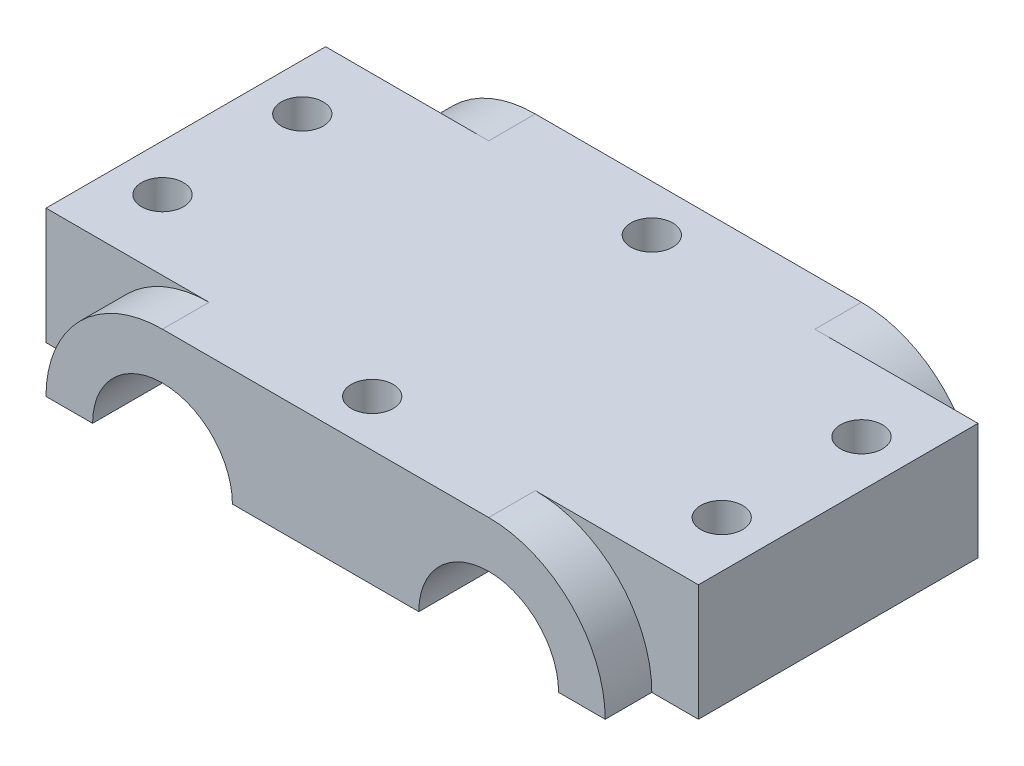
ISO-10303-21;
HEADER;
FILE_DESCRIPTION(('STEP AP214'),'2;1');
FILE_NAME('part.step','',(''),(''),'','','');
FILE_SCHEMA(('AUTOMOTIVE_DESIGN { 1 0 10303 214 1 1 1 1 }'));
ENDSEC;
DATA;
#1=APPLICATION_CONTEXT('core data for automotive mechanical design processes');
#2=APPLICATION_PROTOCOL_DEFINITION('international standard','automotive_design',2000,#1);
#3=PRODUCT_CONTEXT('',#1,'mechanical');
#4=PRODUCT('Part','Part','',(#3));
#5=PRODUCT_RELATED_PRODUCT_CATEGORY('part','',(#4));
#6=PRODUCT_DEFINITION_FORMATION('','',#4);
#7=PRODUCT_DEFINITION_CONTEXT('part definition',#1,'design');
#8=PRODUCT_DEFINITION('design','',#6,#7);
#9=PRODUCT_DEFINITION_SHAPE('','',#8);
#10=(LENGTH_UNIT() NAMED_UNIT(*) SI_UNIT(.MILLI.,.METRE.));
#11=(NAMED_UNIT(*) PLANE_ANGLE_UNIT() SI_UNIT($,.RADIAN.));
#12=(NAMED_UNIT(*) SI_UNIT($,.STERADIAN.) SOLID_ANGLE_UNIT());
#13=UNCERTAINTY_MEASURE_WITH_UNIT(LENGTH_MEASURE(1.E-05),#10,'distance_accuracy_value','');
#14=(GEOMETRIC_REPRESENTATION_CONTEXT(3) GLOBAL_UNCERTAINTY_ASSIGNED_CONTEXT((#13)) GLOBAL_UNIT_ASSIGNED_CONTEXT((#10,
#11,#12)) REPRESENTATION_CONTEXT('',''));
#15=CARTESIAN_POINT('',(0.,0.,0.));
#16=DIRECTION('',(0.,0.,1.));
#17=DIRECTION('',(1.,0.,0.));
#18=AXIS2_PLACEMENT_3D('',#15,#16,#17);
#19=CARTESIAN_POINT('',(70.,0.,30.));
#20=DIRECTION('',(0.,1.,0.));
#21=DIRECTION('',(-1.,0.,0.));
#22=AXIS2_PLACEMENT_3D('',#19,#20,#21);
#23=PLANE('',#22);
#24=CARTESIAN_POINT('',(35.,0.,30.));
#25=DIRECTION('',(0.,1.,0.));
#26=DIRECTION('',(-1.,0.,0.));
#27=AXIS2_PLACEMENT_3D('',#24,#25,#26);
#28=CIRCLE('',#27,2.25);
#29=CARTESIAN_POINT('',(32.75,0.,30.));
#30=VERTEX_POINT('',#29);
#31=EDGE_CURVE('E294',#30,#30,#28,.T.);
#32=ORIENTED_EDGE('',*,*,#31,.T.);
#33=EDGE_LOOP('',(#32));
#34=FACE_BOUND('',#33,.T.);
#35=CARTESIAN_POINT('',(35.,0.,0.));
#36=DIRECTION('',(0.,1.,0.));
#37=DIRECTION('',(-1.,0.,0.));
#38=AXIS2_PLACEMENT_3D('',#35,#36,#37);
#39=CIRCLE('',#38,2.25);
#40=CARTESIAN_POINT('',(32.75,0.,0.));
#41=VERTEX_POINT('',#40);
#42=EDGE_CURVE('E309',#41,#41,#39,.T.);
#43=ORIENTED_EDGE('',*,*,#42,.T.);
#44=EDGE_LOOP('',(#43));
#45=FACE_BOUND('',#44,.T.);
#46=DIRECTION('',(0.,0.,-1.));
#47=VECTOR('',#46,1.);
#48=CARTESIAN_POINT('',(25.,0.,35.));
#49=LINE('',#48,#47);
#50=CARTESIAN_POINT('',(25.,0.,35.));
#51=VERTEX_POINT('',#50);
#52=CARTESIAN_POINT('',(25.,0.,-5.));
#53=VERTEX_POINT('',#52);
#54=EDGE_CURVE('E284',#51,#53,#49,.T.);
#55=ORIENTED_EDGE('',*,*,#54,.T.);
#56=DIRECTION('',(1.,0.,0.));
#57=VECTOR('',#56,1.);
#58=CARTESIAN_POINT('',(35.,0.,-5.));
#59=LINE('',#58,#57);
#60=CARTESIAN_POINT('',(45.,0.,-5.));
#61=VERTEX_POINT('',#60);
#62=EDGE_CURVE('E170',#53,#61,#59,.T.);
#63=ORIENTED_EDGE('',*,*,#62,.T.);
#64=DIRECTION('',(0.,0.,-1.));
#65=VECTOR('',#64,1.);
#66=CARTESIAN_POINT('',(45.,0.,35.));
#67=LINE('',#66,#65);
#68=CARTESIAN_POINT('',(45.,0.,35.));
#69=VERTEX_POINT('',#68);
#70=EDGE_CURVE('E156',#69,#61,#67,.T.);
#71=ORIENTED_EDGE('',*,*,#70,.F.);
#72=DIRECTION('',(1.,0.,0.));
#73=VECTOR('',#72,1.);
#74=CARTESIAN_POINT('',(45.,0.,35.));
#75=LINE('',#74,#73);
#76=EDGE_CURVE('E162',#51,#69,#75,.T.);
#77=ORIENTED_EDGE('',*,*,#76,.F.);
#78=EDGE_LOOP('',(#55,#63,#71,#77));
#79=FACE_BOUND('',#78,.T.);
#80=ADVANCED_FACE('F39',(#34,#45,#79),#23,.F.);
#81=CARTESIAN_POINT('',(65.,0.,7.5));
#82=DIRECTION('',(0.,1.,0.));
#83=DIRECTION('',(-1.,0.,0.));
#84=AXIS2_PLACEMENT_3D('',#81,#82,#83);
#85=CIRCLE('',#84,2.25);
#86=CARTESIAN_POINT('',(62.75,0.,7.5));
#87=VERTEX_POINT('',#86);
#88=EDGE_CURVE('E292',#87,#87,#85,.T.);
#89=ORIENTED_EDGE('',*,*,#88,.T.);
#90=EDGE_LOOP('',(#89));
#91=FACE_BOUND('',#90,.T.);
#92=CARTESIAN_POINT('',(65.,0.,22.5));
#93=DIRECTION('',(0.,1.,0.));
#94=DIRECTION('',(-1.,0.,0.));
#95=AXIS2_PLACEMENT_3D('',#92,#93,#94);
#96=CIRCLE('',#95,2.25);
#97=CARTESIAN_POINT('',(62.75,0.,22.5));
#98=VERTEX_POINT('',#97);
#99=EDGE_CURVE('E315',#98,#98,#96,.T.);
#100=ORIENTED_EDGE('',*,*,#99,.T.);
#101=EDGE_LOOP('',(#100));
#102=FACE_BOUND('',#101,.T.);
#103=DIRECTION('',(0.,0.,-1.));
#104=VECTOR('',#103,1.);
#105=CARTESIAN_POINT('',(60.,0.,35.));
#106=LINE('',#105,#104);
#107=CARTESIAN_POINT('',(60.,0.,35.));
#108=VERTEX_POINT('',#107);
#109=CARTESIAN_POINT('',(60.,0.,-5.));
#110=VERTEX_POINT('',#109);
#111=EDGE_CURVE('E158',#108,#110,#106,.T.);
#112=ORIENTED_EDGE('',*,*,#111,.T.);
#113=DIRECTION('',(1.,0.,0.));
#114=VECTOR('',#113,1.);
#115=CARTESIAN_POINT('',(65.,0.,-5.));
#116=LINE('',#115,#114);
#117=CARTESIAN_POINT('',(65.,0.,-5.));
#118=VERTEX_POINT('',#117);
#119=EDGE_CURVE('E266',#110,#118,#116,.T.);
#120=ORIENTED_EDGE('',*,*,#119,.T.);
#121=DIRECTION('',(0.,0.,-1.));
#122=VECTOR('',#121,1.);
#123=CARTESIAN_POINT('',(65.,0.,35.));
#124=LINE('',#123,#122);
#125=CARTESIAN_POINT('',(65.,0.,0.));
#126=VERTEX_POINT('',#125);
#127=EDGE_CURVE('E251',#126,#118,#124,.T.);
#128=ORIENTED_EDGE('',*,*,#127,.F.);
#129=DIRECTION('',(1.,0.,0.));
#130=VECTOR('',#129,1.);
#131=CARTESIAN_POINT('',(70.,0.,0.));
#132=LINE('',#131,#130);
#133=CARTESIAN_POINT('',(70.,0.,0.));
#134=VERTEX_POINT('',#133);
#135=EDGE_CURVE('E182',#126,#134,#132,.T.);
#136=ORIENTED_EDGE('',*,*,#135,.T.);
#137=DIRECTION('',(0.,0.,-1.));
#138=VECTOR('',#137,1.);
#139=CARTESIAN_POINT('',(70.,0.,30.));
#140=LINE('',#139,#138);
#141=CARTESIAN_POINT('',(70.,0.,30.));
#142=VERTEX_POINT('',#141);
#143=EDGE_CURVE('E212',#142,#134,#140,.T.);
#144=ORIENTED_EDGE('',*,*,#143,.F.);
#145=DIRECTION('',(1.,0.,0.));
#146=VECTOR('',#145,1.);
#147=CARTESIAN_POINT('',(70.,0.,30.));
#148=LINE('',#147,#146);
#149=CARTESIAN_POINT('',(65.,0.,30.));
#150=VERTEX_POINT('',#149);
#151=EDGE_CURVE('E186',#150,#142,#148,.T.);
#152=ORIENTED_EDGE('',*,*,#151,.F.);
#153=CARTESIAN_POINT('',(65.,0.,35.));
#154=VERTEX_POINT('',#153);
#155=EDGE_CURVE('E177',#154,#150,#124,.T.);
#156=ORIENTED_EDGE('',*,*,#155,.F.);
#157=DIRECTION('',(1.,0.,0.));
#158=VECTOR('',#157,1.);
#159=CARTESIAN_POINT('',(65.,0.,35.));
#160=LINE('',#159,#158);
#161=EDGE_CURVE('E161',#108,#154,#160,.T.);
#162=ORIENTED_EDGE('',*,*,#161,.F.);
#163=EDGE_LOOP('',(#112,#120,#128,#136,#144,#152,#156,#162));
#164=FACE_BOUND('',#163,.T.);
#165=ADVANCED_FACE('F267',(#91,#102,#164),#23,.F.);
#166=CARTESIAN_POINT('',(0.,0.,30.));
#167=DIRECTION('',(0.,0.,-1.));
#168=DIRECTION('',(-1.,0.,0.));
#169=AXIS2_PLACEMENT_3D('',#166,#167,#168);
#170=PLANE('',#169);
#171=CARTESIAN_POINT('',(52.5,0.,30.));
#172=DIRECTION('',(0.,0.,-1.));
#173=DIRECTION('',(-1.,0.,0.));
#174=AXIS2_PLACEMENT_3D('',#171,#172,#173);
#175=CIRCLE('',#174,12.5);
#176=CARTESIAN_POINT('',(52.5,12.5,30.));
#177=VERTEX_POINT('',#176);
#178=EDGE_CURVE('E175',#150,#177,#175,.F.);
#179=ORIENTED_EDGE('',*,*,#178,.F.);
#180=ORIENTED_EDGE('',*,*,#151,.T.);
#181=DIRECTION('',(0.,1.,0.));
#182=VECTOR('',#181,1.);
#183=CARTESIAN_POINT('',(70.,12.5,30.));
#184=LINE('',#183,#182);
#185=CARTESIAN_POINT('',(70.,12.5,30.));
#186=VERTEX_POINT('',#185);
#187=EDGE_CURVE('E185',#142,#186,#184,.T.);
#188=ORIENTED_EDGE('',*,*,#187,.T.);
#189=DIRECTION('',(-1.,0.,0.));
#190=VECTOR('',#189,1.);
#191=CARTESIAN_POINT('',(0.,12.5,30.));
#192=LINE('',#191,#190);
#193=EDGE_CURVE('E62',#186,#177,#192,.T.);
#194=ORIENTED_EDGE('',*,*,#193,.T.);
#195=EDGE_LOOP('',(#179,#180,#188,#194));
#196=FACE_BOUND('',#195,.T.);
#197=ADVANCED_FACE('F368',(#196),#170,.F.);
#198=CARTESIAN_POINT('',(17.5,0.,30.));
#199=DIRECTION('',(0.,0.,-1.));
#200=DIRECTION('',(-1.,0.,0.));
#201=AXIS2_PLACEMENT_3D('',#198,#199,#200);
#202=CIRCLE('',#201,12.5);
#203=CARTESIAN_POINT('',(17.5,12.5,30.));
#204=VERTEX_POINT('',#203);
#205=CARTESIAN_POINT('',(5.,0.,30.));
#206=VERTEX_POINT('',#205);
#207=EDGE_CURVE('E54',#204,#206,#202,.F.);
#208=ORIENTED_EDGE('',*,*,#207,.F.);
#209=CARTESIAN_POINT('',(0.,12.5,30.));
#210=VERTEX_POINT('',#209);
#211=EDGE_CURVE('E188',#204,#210,#192,.T.);
#212=ORIENTED_EDGE('',*,*,#211,.T.);
#213=DIRECTION('',(0.,-1.,0.));
#214=VECTOR('',#213,1.);
#215=CARTESIAN_POINT('',(0.,0.,30.));
#216=LINE('',#215,#214);
#217=CARTESIAN_POINT('',(0.,0.,30.));
#218=VERTEX_POINT('',#217);
#219=EDGE_CURVE('E190',#210,#218,#216,.T.);
#220=ORIENTED_EDGE('',*,*,#219,.T.);
#221=EDGE_CURVE('E183',#218,#206,#148,.T.);
#222=ORIENTED_EDGE('',*,*,#221,.T.);
#223=EDGE_LOOP('',(#208,#212,#220,#222));
#224=FACE_BOUND('',#223,.T.);
#225=ADVANCED_FACE('F373',(#224),#170,.F.);
#226=CARTESIAN_POINT('',(0.,0.,0.));
#227=DIRECTION('',(0.,0.,-1.));
#228=DIRECTION('',(-1.,0.,0.));
#229=AXIS2_PLACEMENT_3D('',#226,#227,#228);
#230=PLANE('',#229);
#231=ORIENTED_EDGE('',*,*,#135,.F.);
#232=CARTESIAN_POINT('',(52.5,0.,0.));
#233=DIRECTION('',(0.,0.,-1.));
#234=DIRECTION('',(-1.,0.,0.));
#235=AXIS2_PLACEMENT_3D('',#232,#233,#234);
#236=CIRCLE('',#235,12.5);
#237=CARTESIAN_POINT('',(52.5,12.5,0.));
#238=VERTEX_POINT('',#237);
#239=EDGE_CURVE('E11',#126,#238,#236,.F.);
#240=ORIENTED_EDGE('',*,*,#239,.T.);
#241=DIRECTION('',(-1.,0.,0.));
#242=VECTOR('',#241,1.);
#243=CARTESIAN_POINT('',(0.,12.5,0.));
#244=LINE('',#243,#242);
#245=CARTESIAN_POINT('',(70.,12.5,0.));
#246=VERTEX_POINT('',#245);
#247=EDGE_CURVE('E199',#246,#238,#244,.T.);
#248=ORIENTED_EDGE('',*,*,#247,.F.);
#249=DIRECTION('',(0.,1.,0.));
#250=VECTOR('',#249,1.);
#251=CARTESIAN_POINT('',(70.,12.5,0.));
#252=LINE('',#251,#250);
#253=EDGE_CURVE('E196',#134,#246,#252,.T.);
#254=ORIENTED_EDGE('',*,*,#253,.F.);
#255=EDGE_LOOP('',(#231,#240,#248,#254));
#256=FACE_BOUND('',#255,.T.);
#257=ADVANCED_FACE('F363',(#256),#230,.T.);
#258=CARTESIAN_POINT('',(17.5,12.5,0.));
#259=VERTEX_POINT('',#258);
#260=CARTESIAN_POINT('',(0.,12.5,0.));
#261=VERTEX_POINT('',#260);
#262=EDGE_CURVE('E198',#259,#261,#244,.T.);
#263=ORIENTED_EDGE('',*,*,#262,.F.);
#264=CARTESIAN_POINT('',(17.5,0.,0.));
#265=DIRECTION('',(0.,0.,-1.));
#266=DIRECTION('',(-1.,0.,0.));
#267=AXIS2_PLACEMENT_3D('',#264,#265,#266);
#268=CIRCLE('',#267,12.5);
#269=CARTESIAN_POINT('',(5.,0.,0.));
#270=VERTEX_POINT('',#269);
#271=EDGE_CURVE('E47',#259,#270,#268,.F.);
#272=ORIENTED_EDGE('',*,*,#271,.T.);
#273=CARTESIAN_POINT('',(0.,0.,0.));
#274=VERTEX_POINT('',#273);
#275=EDGE_CURVE('E193',#274,#270,#132,.T.);
#276=ORIENTED_EDGE('',*,*,#275,.F.);
#277=DIRECTION('',(0.,-1.,0.));
#278=VECTOR('',#277,1.);
#279=CARTESIAN_POINT('',(0.,0.,0.));
#280=LINE('',#279,#278);
#281=EDGE_CURVE('E202',#261,#274,#280,.T.);
#282=ORIENTED_EDGE('',*,*,#281,.F.);
#283=EDGE_LOOP('',(#263,#272,#276,#282));
#284=FACE_BOUND('',#283,.T.);
#285=ADVANCED_FACE('F218',(#284),#230,.T.);
#286=CARTESIAN_POINT('',(5.,0.,22.5));
#287=DIRECTION('',(0.,1.,0.));
#288=DIRECTION('',(-1.,0.,0.));
#289=AXIS2_PLACEMENT_3D('',#286,#287,#288);
#290=CIRCLE('',#289,2.25);
#291=CARTESIAN_POINT('',(2.75,0.,22.5));
#292=VERTEX_POINT('',#291);
#293=EDGE_CURVE('E312',#292,#292,#290,.T.);
#294=ORIENTED_EDGE('',*,*,#293,.T.);
#295=EDGE_LOOP('',(#294));
#296=FACE_BOUND('',#295,.T.);
#297=CARTESIAN_POINT('',(5.,0.,7.5));
#298=DIRECTION('',(0.,1.,0.));
#299=DIRECTION('',(-1.,0.,0.));
#300=AXIS2_PLACEMENT_3D('',#297,#298,#299);
#301=CIRCLE('',#300,2.25);
#302=CARTESIAN_POINT('',(2.75,0.,7.5));
#303=VERTEX_POINT('',#302);
#304=EDGE_CURVE('E318',#303,#303,#301,.T.);
#305=ORIENTED_EDGE('',*,*,#304,.T.);
#306=EDGE_LOOP('',(#305));
#307=FACE_BOUND('',#306,.T.);
#308=DIRECTION('',(1.,0.,0.));
#309=VECTOR('',#308,1.);
#310=CARTESIAN_POINT('',(10.,0.,-5.));
#311=LINE('',#310,#309);
#312=CARTESIAN_POINT('',(5.,0.,-5.));
#313=VERTEX_POINT('',#312);
#314=CARTESIAN_POINT('',(10.,0.,-5.));
#315=VERTEX_POINT('',#314);
#316=EDGE_CURVE('E278',#313,#315,#311,.T.);
#317=ORIENTED_EDGE('',*,*,#316,.T.);
#318=DIRECTION('',(0.,0.,-1.));
#319=VECTOR('',#318,1.);
#320=CARTESIAN_POINT('',(10.,0.,35.));
#321=LINE('',#320,#319);
#322=CARTESIAN_POINT('',(10.,0.,35.));
#323=VERTEX_POINT('',#322);
#324=EDGE_CURVE('E285',#323,#315,#321,.T.);
#325=ORIENTED_EDGE('',*,*,#324,.F.);
#326=DIRECTION('',(1.,0.,0.));
#327=VECTOR('',#326,1.);
#328=CARTESIAN_POINT('',(10.,0.,35.));
#329=LINE('',#328,#327);
#330=CARTESIAN_POINT('',(5.,0.,35.));
#331=VERTEX_POINT('',#330);
#332=EDGE_CURVE('E298',#331,#323,#329,.T.);
#333=ORIENTED_EDGE('',*,*,#332,.F.);
#334=DIRECTION('',(0.,0.,-1.));
#335=VECTOR('',#334,1.);
#336=CARTESIAN_POINT('',(5.,0.,35.));
#337=LINE('',#336,#335);
#338=EDGE_CURVE('E243',#331,#206,#337,.T.);
#339=ORIENTED_EDGE('',*,*,#338,.T.);
#340=ORIENTED_EDGE('',*,*,#221,.F.);
#341=DIRECTION('',(0.,0.,-1.));
#342=VECTOR('',#341,1.);
#343=CARTESIAN_POINT('',(0.,0.,30.));
#344=LINE('',#343,#342);
#345=EDGE_CURVE('E192',#218,#274,#344,.T.);
#346=ORIENTED_EDGE('',*,*,#345,.T.);
#347=ORIENTED_EDGE('',*,*,#275,.T.);
#348=EDGE_CURVE('E224',#270,#313,#337,.T.);
#349=ORIENTED_EDGE('',*,*,#348,.T.);
#350=EDGE_LOOP('',(#317,#325,#333,#339,#340,#346,#347,#349));
#351=FACE_BOUND('',#350,.T.);
#352=ADVANCED_FACE('F41',(#296,#307,#351),#23,.F.);
#353=CARTESIAN_POINT('',(70.,12.5,30.));
#354=DIRECTION('',(-1.,0.,0.));
#355=DIRECTION('',(0.,0.,1.));
#356=AXIS2_PLACEMENT_3D('',#353,#354,#355);
#357=PLANE('',#356);
#358=ORIENTED_EDGE('',*,*,#253,.T.);
#359=DIRECTION('',(0.,0.,-1.));
#360=VECTOR('',#359,1.);
#361=CARTESIAN_POINT('',(70.,12.5,30.));
#362=LINE('',#361,#360);
#363=EDGE_CURVE('E209',#186,#246,#362,.T.);
#364=ORIENTED_EDGE('',*,*,#363,.F.);
#365=ORIENTED_EDGE('',*,*,#187,.F.);
#366=ORIENTED_EDGE('',*,*,#143,.T.);
#367=EDGE_LOOP('',(#358,#364,#365,#366));
#368=FACE_BOUND('',#367,.T.);
#369=ADVANCED_FACE('F345',(#368),#357,.F.);
#370=CARTESIAN_POINT('',(0.,12.5,30.));
#371=DIRECTION('',(0.,-1.,0.));
#372=DIRECTION('',(0.,0.,-1.));
#373=AXIS2_PLACEMENT_3D('',#370,#371,#372);
#374=PLANE('',#373);
#375=CARTESIAN_POINT('',(65.,12.5,7.5));
#376=DIRECTION('',(0.,1.,0.));
#377=DIRECTION('',(0.,0.,1.));
#378=AXIS2_PLACEMENT_3D('',#375,#376,#377);
#379=CIRCLE('',#378,2.25);
#380=CARTESIAN_POINT('',(65.,12.5,9.74999999999999));
#381=VERTEX_POINT('',#380);
#382=EDGE_CURVE('E331',#381,#381,#379,.T.);
#383=ORIENTED_EDGE('',*,*,#382,.F.);
#384=EDGE_LOOP('',(#383));
#385=FACE_BOUND('',#384,.T.);
#386=CARTESIAN_POINT('',(35.,12.5,30.));
#387=DIRECTION('',(0.,1.,0.));
#388=DIRECTION('',(0.,0.,1.));
#389=AXIS2_PLACEMENT_3D('',#386,#387,#388);
#390=CIRCLE('',#389,2.25);
#391=CARTESIAN_POINT('',(35.,12.5,32.25));
#392=VERTEX_POINT('',#391);
#393=EDGE_CURVE('E328',#392,#392,#390,.T.);
#394=ORIENTED_EDGE('',*,*,#393,.F.);
#395=EDGE_LOOP('',(#394));
#396=FACE_BOUND('',#395,.T.);
#397=CARTESIAN_POINT('',(35.,12.5,0.));
#398=DIRECTION('',(0.,1.,0.));
#399=DIRECTION('',(0.,0.,1.));
#400=AXIS2_PLACEMENT_3D('',#397,#398,#399);
#401=CIRCLE('',#400,2.25);
#402=CARTESIAN_POINT('',(35.,12.5,2.25));
#403=VERTEX_POINT('',#402);
#404=EDGE_CURVE('E325',#403,#403,#401,.T.);
#405=ORIENTED_EDGE('',*,*,#404,.F.);
#406=EDGE_LOOP('',(#405));
#407=FACE_BOUND('',#406,.T.);
#408=CARTESIAN_POINT('',(5.,12.5,22.5));
#409=DIRECTION('',(0.,1.,0.));
#410=DIRECTION('',(0.,0.,1.));
#411=AXIS2_PLACEMENT_3D('',#408,#409,#410);
#412=CIRCLE('',#411,2.25);
#413=CARTESIAN_POINT('',(5.,12.5,24.75));
#414=VERTEX_POINT('',#413);
#415=EDGE_CURVE('E324',#414,#414,#412,.T.);
#416=ORIENTED_EDGE('',*,*,#415,.F.);
#417=EDGE_LOOP('',(#416));
#418=FACE_BOUND('',#417,.T.);
#419=CARTESIAN_POINT('',(65.,12.5,22.5));
#420=DIRECTION('',(0.,1.,0.));
#421=DIRECTION('',(0.,0.,1.));
#422=AXIS2_PLACEMENT_3D('',#419,#420,#421);
#423=CIRCLE('',#422,2.25);
#424=CARTESIAN_POINT('',(65.,12.5,24.75));
#425=VERTEX_POINT('',#424);
#426=EDGE_CURVE('E334',#425,#425,#423,.T.);
#427=ORIENTED_EDGE('',*,*,#426,.F.);
#428=EDGE_LOOP('',(#427));
#429=FACE_BOUND('',#428,.T.);
#430=CARTESIAN_POINT('',(5.,12.5,7.5));
#431=DIRECTION('',(0.,1.,0.));
#432=DIRECTION('',(0.,0.,1.));
#433=AXIS2_PLACEMENT_3D('',#430,#431,#432);
#434=CIRCLE('',#433,2.25);
#435=CARTESIAN_POINT('',(5.,12.5,9.75));
#436=VERTEX_POINT('',#435);
#437=EDGE_CURVE('E321',#436,#436,#434,.T.);
#438=ORIENTED_EDGE('',*,*,#437,.F.);
#439=EDGE_LOOP('',(#438));
#440=FACE_BOUND('',#439,.T.);
#441=ORIENTED_EDGE('',*,*,#247,.T.);
#442=DIRECTION('',(0.,0.,-1.));
#443=VECTOR('',#442,1.);
#444=CARTESIAN_POINT('',(52.5,12.5,35.));
#445=LINE('',#444,#443);
#446=CARTESIAN_POINT('',(52.5,12.5,-5.));
#447=VERTEX_POINT('',#446);
#448=EDGE_CURVE('E245',#238,#447,#445,.T.);
#449=ORIENTED_EDGE('',*,*,#448,.T.);
#450=DIRECTION('',(-1.,0.,0.));
#451=VECTOR('',#450,1.);
#452=CARTESIAN_POINT('',(17.5,12.5,-5.));
#453=LINE('',#452,#451);
#454=CARTESIAN_POINT('',(17.5,12.5,-5.));
#455=VERTEX_POINT('',#454);
#456=EDGE_CURVE('E240',#447,#455,#453,.T.);
#457=ORIENTED_EDGE('',*,*,#456,.T.);
#458=DIRECTION('',(0.,0.,-1.));
#459=VECTOR('',#458,1.);
#460=CARTESIAN_POINT('',(17.5,12.5,35.));
#461=LINE('',#460,#459);
#462=EDGE_CURVE('E238',#259,#455,#461,.T.);
#463=ORIENTED_EDGE('',*,*,#462,.F.);
#464=ORIENTED_EDGE('',*,*,#262,.T.);
#465=DIRECTION('',(0.,0.,-1.));
#466=VECTOR('',#465,1.);
#467=CARTESIAN_POINT('',(0.,12.5,30.));
#468=LINE('',#467,#466);
#469=EDGE_CURVE('E206',#210,#261,#468,.T.);
#470=ORIENTED_EDGE('',*,*,#469,.F.);
#471=ORIENTED_EDGE('',*,*,#211,.F.);
#472=CARTESIAN_POINT('',(17.5,12.5,35.));
#473=VERTEX_POINT('',#472);
#474=EDGE_CURVE('E242',#473,#204,#461,.T.);
#475=ORIENTED_EDGE('',*,*,#474,.F.);
#476=DIRECTION('',(-1.,0.,0.));
#477=VECTOR('',#476,1.);
#478=CARTESIAN_POINT('',(17.5,12.5,35.));
#479=LINE('',#478,#477);
#480=CARTESIAN_POINT('',(52.5,12.5,35.));
#481=VERTEX_POINT('',#480);
#482=EDGE_CURVE('E302',#481,#473,#479,.T.);
#483=ORIENTED_EDGE('',*,*,#482,.F.);
#484=EDGE_CURVE('E249',#481,#177,#445,.T.);
#485=ORIENTED_EDGE('',*,*,#484,.T.);
#486=ORIENTED_EDGE('',*,*,#193,.F.);
#487=ORIENTED_EDGE('',*,*,#363,.T.);
#488=EDGE_LOOP('',(#441,#449,#457,#463,#464,#470,#471,#475,#483,#485,#486,#487));
#489=FACE_BOUND('',#488,.T.);
#490=ADVANCED_FACE('F234',(#385,#396,#407,#418,#429,#440,#489),#374,.F.);
#491=CARTESIAN_POINT('',(0.,0.,30.));
#492=DIRECTION('',(1.,0.,0.));
#493=DIRECTION('',(0.,0.,-1.));
#494=AXIS2_PLACEMENT_3D('',#491,#492,#493);
#495=PLANE('',#494);
#496=ORIENTED_EDGE('',*,*,#281,.T.);
#497=ORIENTED_EDGE('',*,*,#345,.F.);
#498=ORIENTED_EDGE('',*,*,#219,.F.);
#499=ORIENTED_EDGE('',*,*,#469,.T.);
#500=EDGE_LOOP('',(#496,#497,#498,#499));
#501=FACE_BOUND('',#500,.T.);
#502=ADVANCED_FACE('F231',(#501),#495,.F.);
#503=CARTESIAN_POINT('',(17.5,0.,-5.));
#504=DIRECTION('',(0.,0.,1.));
#505=DIRECTION('',(1.,0.,0.));
#506=AXIS2_PLACEMENT_3D('',#503,#504,#505);
#507=PLANE('',#506);
#508=CARTESIAN_POINT('',(52.5,0.,-5.));
#509=DIRECTION('',(0.,0.,-1.));
#510=DIRECTION('',(1.,0.,0.));
#511=AXIS2_PLACEMENT_3D('',#508,#509,#510);
#512=CIRCLE('',#511,7.5);
#513=EDGE_CURVE('E269',#61,#110,#512,.T.);
#514=ORIENTED_EDGE('',*,*,#513,.F.);
#515=ORIENTED_EDGE('',*,*,#62,.F.);
#516=CARTESIAN_POINT('',(17.5,0.,-5.));
#517=DIRECTION('',(0.,0.,-1.));
#518=DIRECTION('',(1.,0.,0.));
#519=AXIS2_PLACEMENT_3D('',#516,#517,#518);
#520=CIRCLE('',#519,7.5);
#521=EDGE_CURVE('E280',#315,#53,#520,.T.);
#522=ORIENTED_EDGE('',*,*,#521,.F.);
#523=ORIENTED_EDGE('',*,*,#316,.F.);
#524=CARTESIAN_POINT('',(17.5,0.,-5.));
#525=DIRECTION('',(0.,0.,1.));
#526=DIRECTION('',(-1.,0.,0.));
#527=AXIS2_PLACEMENT_3D('',#524,#525,#526);
#528=CIRCLE('',#527,12.5);
#529=EDGE_CURVE('E273',#455,#313,#528,.T.);
#530=ORIENTED_EDGE('',*,*,#529,.F.);
#531=ORIENTED_EDGE('',*,*,#456,.F.);
#532=CARTESIAN_POINT('',(52.5,0.,-5.));
#533=DIRECTION('',(0.,0.,1.));
#534=DIRECTION('',(-1.,0.,0.));
#535=AXIS2_PLACEMENT_3D('',#532,#533,#534);
#536=CIRCLE('',#535,12.5);
#537=EDGE_CURVE('E262',#118,#447,#536,.T.);
#538=ORIENTED_EDGE('',*,*,#537,.F.);
#539=ORIENTED_EDGE('',*,*,#119,.F.);
#540=EDGE_LOOP('',(#514,#515,#522,#523,#530,#531,#538,#539));
#541=FACE_BOUND('',#540,.T.);
#542=ADVANCED_FACE('F271',(#541),#507,.F.);
#543=CARTESIAN_POINT('',(17.5,0.,35.));
#544=DIRECTION('',(0.,0.,-1.));
#545=DIRECTION('',(-1.,0.,0.));
#546=AXIS2_PLACEMENT_3D('',#543,#544,#545);
#547=CYLINDRICAL_SURFACE('',#546,12.5);
#548=ORIENTED_EDGE('',*,*,#271,.F.);
#549=ORIENTED_EDGE('',*,*,#462,.T.);
#550=ORIENTED_EDGE('',*,*,#529,.T.);
#551=ORIENTED_EDGE('',*,*,#348,.F.);
#552=EDGE_LOOP('',(#548,#549,#550,#551));
#553=FACE_BOUND('',#552,.T.);
#554=ADVANCED_FACE('F403',(#553),#547,.T.);
#555=CARTESIAN_POINT('',(52.5,0.,35.));
#556=DIRECTION('',(0.,0.,-1.));
#557=DIRECTION('',(-1.,0.,0.));
#558=AXIS2_PLACEMENT_3D('',#555,#556,#557);
#559=CYLINDRICAL_SURFACE('',#558,12.5);
#560=ORIENTED_EDGE('',*,*,#239,.F.);
#561=ORIENTED_EDGE('',*,*,#127,.T.);
#562=ORIENTED_EDGE('',*,*,#537,.T.);
#563=ORIENTED_EDGE('',*,*,#448,.F.);
#564=EDGE_LOOP('',(#560,#561,#562,#563));
#565=FACE_BOUND('',#564,.T.);
#566=ADVANCED_FACE('F260',(#565),#559,.T.);
#567=CARTESIAN_POINT('',(52.5,0.,35.));
#568=DIRECTION('',(0.,0.,-1.));
#569=DIRECTION('',(-1.,0.,0.));
#570=AXIS2_PLACEMENT_3D('',#567,#568,#569);
#571=CYLINDRICAL_SURFACE('',#570,7.5);
#572=ORIENTED_EDGE('',*,*,#70,.T.);
#573=ORIENTED_EDGE('',*,*,#513,.T.);
#574=ORIENTED_EDGE('',*,*,#111,.F.);
#575=CARTESIAN_POINT('',(52.5,0.,35.));
#576=DIRECTION('',(0.,0.,-1.));
#577=DIRECTION('',(1.,0.,0.));
#578=AXIS2_PLACEMENT_3D('',#575,#576,#577);
#579=CIRCLE('',#578,7.5);
#580=EDGE_CURVE('E151',#69,#108,#579,.T.);
#581=ORIENTED_EDGE('',*,*,#580,.F.);
#582=EDGE_LOOP('',(#572,#573,#574,#581));
#583=FACE_BOUND('',#582,.T.);
#584=ADVANCED_FACE('F153',(#583),#571,.F.);
#585=ORIENTED_EDGE('',*,*,#155,.T.);
#586=ORIENTED_EDGE('',*,*,#178,.T.);
#587=ORIENTED_EDGE('',*,*,#484,.F.);
#588=CARTESIAN_POINT('',(52.5,0.,35.));
#589=DIRECTION('',(0.,0.,1.));
#590=DIRECTION('',(-1.,0.,0.));
#591=AXIS2_PLACEMENT_3D('',#588,#589,#590);
#592=CIRCLE('',#591,12.5);
#593=EDGE_CURVE('E304',#154,#481,#592,.T.);
#594=ORIENTED_EDGE('',*,*,#593,.F.);
#595=EDGE_LOOP('',(#585,#586,#587,#594));
#596=FACE_BOUND('',#595,.T.);
#597=ADVANCED_FACE('F411',(#596),#559,.T.);
#598=ORIENTED_EDGE('',*,*,#474,.T.);
#599=ORIENTED_EDGE('',*,*,#207,.T.);
#600=ORIENTED_EDGE('',*,*,#338,.F.);
#601=CARTESIAN_POINT('',(17.5,0.,35.));
#602=DIRECTION('',(0.,0.,1.));
#603=DIRECTION('',(-1.,0.,0.));
#604=AXIS2_PLACEMENT_3D('',#601,#602,#603);
#605=CIRCLE('',#604,12.5);
#606=EDGE_CURVE('E300',#473,#331,#605,.T.);
#607=ORIENTED_EDGE('',*,*,#606,.F.);
#608=EDGE_LOOP('',(#598,#599,#600,#607));
#609=FACE_BOUND('',#608,.T.);
#610=ADVANCED_FACE('F406',(#609),#547,.T.);
#611=CARTESIAN_POINT('',(17.5,0.,35.));
#612=DIRECTION('',(0.,0.,-1.));
#613=DIRECTION('',(-1.,0.,0.));
#614=AXIS2_PLACEMENT_3D('',#611,#612,#613);
#615=CYLINDRICAL_SURFACE('',#614,7.5);
#616=ORIENTED_EDGE('',*,*,#324,.T.);
#617=ORIENTED_EDGE('',*,*,#521,.T.);
#618=ORIENTED_EDGE('',*,*,#54,.F.);
#619=CARTESIAN_POINT('',(17.5,0.,35.));
#620=DIRECTION('',(0.,0.,-1.));
#621=DIRECTION('',(1.,0.,0.));
#622=AXIS2_PLACEMENT_3D('',#619,#620,#621);
#623=CIRCLE('',#622,7.5);
#624=EDGE_CURVE('E167',#323,#51,#623,.T.);
#625=ORIENTED_EDGE('',*,*,#624,.F.);
#626=EDGE_LOOP('',(#616,#617,#618,#625));
#627=FACE_BOUND('',#626,.T.);
#628=ADVANCED_FACE('F288',(#627),#615,.F.);
#629=CARTESIAN_POINT('',(17.5,0.,35.));
#630=DIRECTION('',(0.,0.,1.));
#631=DIRECTION('',(1.,0.,0.));
#632=AXIS2_PLACEMENT_3D('',#629,#630,#631);
#633=PLANE('',#632);
#634=ORIENTED_EDGE('',*,*,#76,.T.);
#635=ORIENTED_EDGE('',*,*,#580,.T.);
#636=ORIENTED_EDGE('',*,*,#161,.T.);
#637=ORIENTED_EDGE('',*,*,#593,.T.);
#638=ORIENTED_EDGE('',*,*,#482,.T.);
#639=ORIENTED_EDGE('',*,*,#606,.T.);
#640=ORIENTED_EDGE('',*,*,#332,.T.);
#641=ORIENTED_EDGE('',*,*,#624,.T.);
#642=EDGE_LOOP('',(#634,#635,#636,#637,#638,#639,#640,#641));
#643=FACE_BOUND('',#642,.T.);
#644=ADVANCED_FACE('F165',(#643),#633,.T.);
#645=CARTESIAN_POINT('',(5.,-27.5,7.5));
#646=DIRECTION('',(0.,1.,0.));
#647=DIRECTION('',(0.,0.,1.));
#648=AXIS2_PLACEMENT_3D('',#645,#646,#647);
#649=CYLINDRICAL_SURFACE('',#648,2.25);
#650=ORIENTED_EDGE('',*,*,#437,.T.);
#651=EDGE_LOOP('',(#650));
#652=FACE_BOUND('',#651,.T.);
#653=ORIENTED_EDGE('',*,*,#304,.F.);
#654=EDGE_LOOP('',(#653));
#655=FACE_BOUND('',#654,.T.);
#656=ADVANCED_FACE('F350',(#652,#655),#649,.F.);
#657=CARTESIAN_POINT('',(65.,-27.5,22.5));
#658=DIRECTION('',(0.,1.,0.));
#659=DIRECTION('',(0.,0.,1.));
#660=AXIS2_PLACEMENT_3D('',#657,#658,#659);
#661=CYLINDRICAL_SURFACE('',#660,2.25);
#662=ORIENTED_EDGE('',*,*,#426,.T.);
#663=EDGE_LOOP('',(#662));
#664=FACE_BOUND('',#663,.T.);
#665=ORIENTED_EDGE('',*,*,#99,.F.);
#666=EDGE_LOOP('',(#665));
#667=FACE_BOUND('',#666,.T.);
#668=ADVANCED_FACE('F340',(#664,#667),#661,.F.);
#669=CARTESIAN_POINT('',(5.,-27.5,22.5));
#670=DIRECTION('',(0.,1.,0.));
#671=DIRECTION('',(0.,0.,1.));
#672=AXIS2_PLACEMENT_3D('',#669,#670,#671);
#673=CYLINDRICAL_SURFACE('',#672,2.25);
#674=ORIENTED_EDGE('',*,*,#415,.T.);
#675=EDGE_LOOP('',(#674));
#676=FACE_BOUND('',#675,.T.);
#677=ORIENTED_EDGE('',*,*,#293,.F.);
#678=EDGE_LOOP('',(#677));
#679=FACE_BOUND('',#678,.T.);
#680=ADVANCED_FACE('F379',(#676,#679),#673,.F.);
#681=CARTESIAN_POINT('',(35.,-27.5,0.));
#682=DIRECTION('',(0.,1.,0.));
#683=DIRECTION('',(0.,0.,1.));
#684=AXIS2_PLACEMENT_3D('',#681,#682,#683);
#685=CYLINDRICAL_SURFACE('',#684,2.25);
#686=ORIENTED_EDGE('',*,*,#404,.T.);
#687=EDGE_LOOP('',(#686));
#688=FACE_BOUND('',#687,.T.);
#689=ORIENTED_EDGE('',*,*,#42,.F.);
#690=EDGE_LOOP('',(#689));
#691=FACE_BOUND('',#690,.T.);
#692=ADVANCED_FACE('F384',(#688,#691),#685,.F.);
#693=CARTESIAN_POINT('',(35.,-27.5,30.));
#694=DIRECTION('',(0.,1.,0.));
#695=DIRECTION('',(0.,0.,1.));
#696=AXIS2_PLACEMENT_3D('',#693,#694,#695);
#697=CYLINDRICAL_SURFACE('',#696,2.25);
#698=ORIENTED_EDGE('',*,*,#393,.T.);
#699=EDGE_LOOP('',(#698));
#700=FACE_BOUND('',#699,.T.);
#701=ORIENTED_EDGE('',*,*,#31,.F.);
#702=EDGE_LOOP('',(#701));
#703=FACE_BOUND('',#702,.T.);
#704=ADVANCED_FACE('F388',(#700,#703),#697,.F.);
#705=CARTESIAN_POINT('',(65.,-27.5,7.5));
#706=DIRECTION('',(0.,1.,0.));
#707=DIRECTION('',(0.,0.,1.));
#708=AXIS2_PLACEMENT_3D('',#705,#706,#707);
#709=CYLINDRICAL_SURFACE('',#708,2.25);
#710=ORIENTED_EDGE('',*,*,#382,.T.);
#711=EDGE_LOOP('',(#710));
#712=FACE_BOUND('',#711,.T.);
#713=ORIENTED_EDGE('',*,*,#88,.F.);
#714=EDGE_LOOP('',(#713));
#715=FACE_BOUND('',#714,.T.);
#716=ADVANCED_FACE('F391',(#712,#715),#709,.F.);
#717=CLOSED_SHELL('',(#80,#165,#197,#225,#257,#285,#352,#369,#490,#502,#542,#554,#566,#584,#597,
#610,#628,#644,#656,#668,#680,#692,#704,#716));
#718=MANIFOLD_SOLID_BREP('B2',#717);
#719=ADVANCED_BREP_SHAPE_REPRESENTATION('',(#18,#718),#14);
#720=SHAPE_DEFINITION_REPRESENTATION(#9,#719);
ENDSEC;
END-ISO-10303-21;
